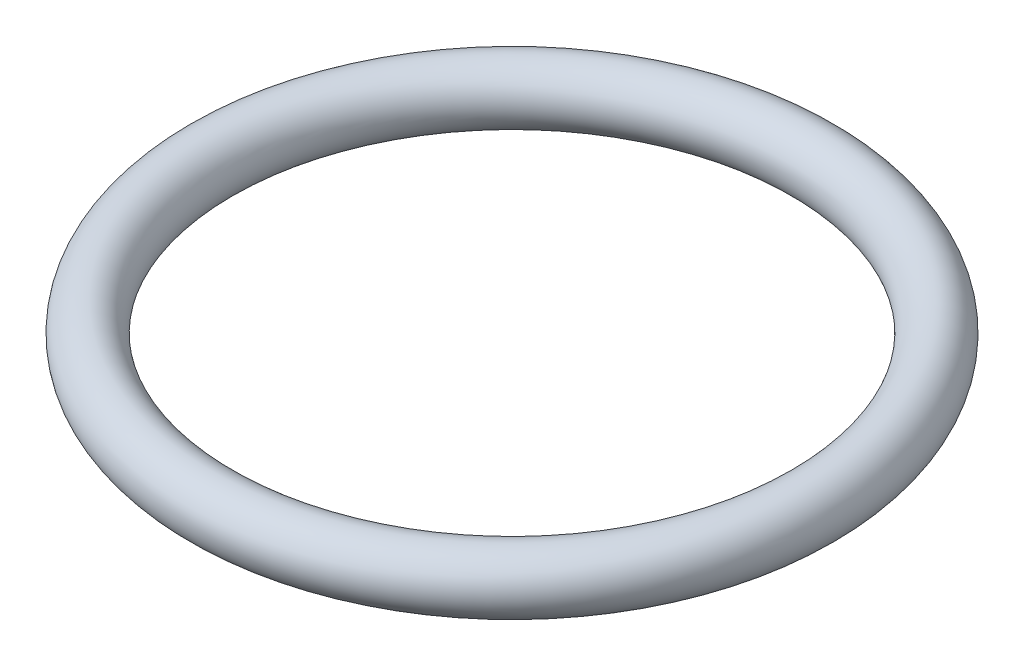
ISO-10303-21;
HEADER;
FILE_DESCRIPTION(('STEP AP214'),'2;1');
FILE_NAME('part.step','',(''),(''),'','','');
FILE_SCHEMA(('AUTOMOTIVE_DESIGN { 1 0 10303 214 1 1 1 1 }'));
ENDSEC;
DATA;
#1=APPLICATION_CONTEXT('core data for automotive mechanical design processes');
#2=APPLICATION_PROTOCOL_DEFINITION('international standard','automotive_design',2000,#1);
#3=PRODUCT_CONTEXT('',#1,'mechanical');
#4=PRODUCT('Part','Part','',(#3));
#5=PRODUCT_RELATED_PRODUCT_CATEGORY('part','',(#4));
#6=PRODUCT_DEFINITION_FORMATION('','',#4);
#7=PRODUCT_DEFINITION_CONTEXT('part definition',#1,'design');
#8=PRODUCT_DEFINITION('design','',#6,#7);
#9=PRODUCT_DEFINITION_SHAPE('','',#8);
#10=(LENGTH_UNIT() NAMED_UNIT(*) SI_UNIT(.MILLI.,.METRE.));
#11=(NAMED_UNIT(*) PLANE_ANGLE_UNIT() SI_UNIT($,.RADIAN.));
#12=(NAMED_UNIT(*) SI_UNIT($,.STERADIAN.) SOLID_ANGLE_UNIT());
#13=UNCERTAINTY_MEASURE_WITH_UNIT(LENGTH_MEASURE(1.E-05),#10,'distance_accuracy_value','');
#14=(GEOMETRIC_REPRESENTATION_CONTEXT(3) GLOBAL_UNCERTAINTY_ASSIGNED_CONTEXT((#13)) GLOBAL_UNIT_ASSIGNED_CONTEXT((#10,
#11,#12)) REPRESENTATION_CONTEXT('',''));
#15=CARTESIAN_POINT('',(0.,0.,0.));
#16=DIRECTION('',(0.,0.,1.));
#17=DIRECTION('',(1.,0.,0.));
#18=AXIS2_PLACEMENT_3D('',#15,#16,#17);
#19=CARTESIAN_POINT('',(0.,0.,0.));
#20=DIRECTION('',(0.,-1.,0.));
#21=DIRECTION('',(1.,0.,0.));
#22=AXIS2_PLACEMENT_3D('',#19,#20,#21);
#23=TOROIDAL_SURFACE('',#22,25.5,2.5);
#24=CARTESIAN_POINT('',(28.,0.,0.));
#25=VERTEX_POINT('',#24);
#26=VERTEX_LOOP('',#25);
#27=FACE_BOUND('',#26,.T.);
#28=ADVANCED_FACE('F29',(#27),#23,.T.);
#29=CLOSED_SHELL('',(#28));
#30=MANIFOLD_SOLID_BREP('B2',#29);
#31=ADVANCED_BREP_SHAPE_REPRESENTATION('',(#18,#30),#14);
#32=SHAPE_DEFINITION_REPRESENTATION(#9,#31);
ENDSEC;
END-ISO-10303-21;
